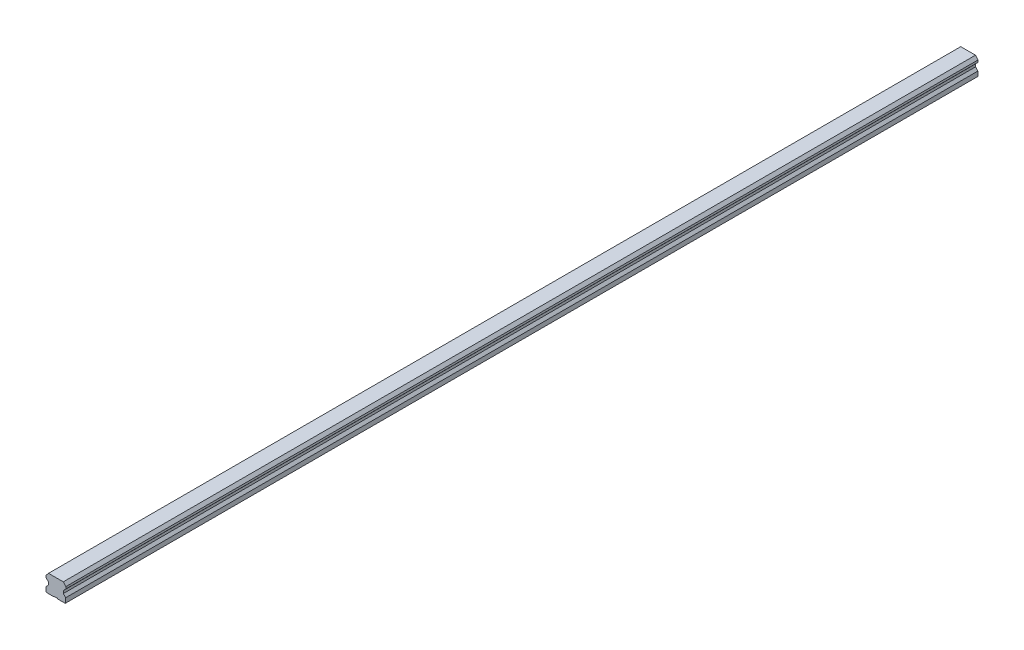
ISO-10303-21;
HEADER;
FILE_DESCRIPTION(('STEP AP214'),'2;1');
FILE_NAME('part.step','',(''),(''),'','','');
FILE_SCHEMA(('AUTOMOTIVE_DESIGN { 1 0 10303 214 1 1 1 1 }'));
ENDSEC;
DATA;
#1=APPLICATION_CONTEXT('core data for automotive mechanical design processes');
#2=APPLICATION_PROTOCOL_DEFINITION('international standard','automotive_design',2000,#1);
#3=PRODUCT_CONTEXT('',#1,'mechanical');
#4=PRODUCT('Part','Part','',(#3));
#5=PRODUCT_RELATED_PRODUCT_CATEGORY('part','',(#4));
#6=PRODUCT_DEFINITION_FORMATION('','',#4);
#7=PRODUCT_DEFINITION_CONTEXT('part definition',#1,'design');
#8=PRODUCT_DEFINITION('design','',#6,#7);
#9=PRODUCT_DEFINITION_SHAPE('','',#8);
#10=(LENGTH_UNIT() NAMED_UNIT(*) SI_UNIT(.MILLI.,.METRE.));
#11=(NAMED_UNIT(*) PLANE_ANGLE_UNIT() SI_UNIT($,.RADIAN.));
#12=(NAMED_UNIT(*) SI_UNIT($,.STERADIAN.) SOLID_ANGLE_UNIT());
#13=UNCERTAINTY_MEASURE_WITH_UNIT(LENGTH_MEASURE(1.E-05),#10,'distance_accuracy_value','');
#14=(GEOMETRIC_REPRESENTATION_CONTEXT(3) GLOBAL_UNCERTAINTY_ASSIGNED_CONTEXT((#13)) GLOBAL_UNIT_ASSIGNED_CONTEXT((#10,
#11,#12)) REPRESENTATION_CONTEXT('',''));
#15=CARTESIAN_POINT('',(0.,0.,0.));
#16=DIRECTION('',(0.,0.,1.));
#17=DIRECTION('',(1.,0.,0.));
#18=AXIS2_PLACEMENT_3D('',#15,#16,#17);
#19=CARTESIAN_POINT('',(20.8842821370548,-19.4456485052694,470.));
#20=DIRECTION('',(0.722739769745018,0.691120268281085,0.));
#21=DIRECTION('',(-0.691120268281085,0.722739769745018,0.));
#22=AXIS2_PLACEMENT_3D('',#19,#20,#21);
#23=PLANE('',#22);
#24=DIRECTION('',(0.691120268281085,-0.722739769745018,0.));
#25=VECTOR('',#24,1.);
#26=CARTESIAN_POINT('',(20.8842821370548,-19.4456485052694,-470.));
#27=LINE('',#26,#25);
#28=CARTESIAN_POINT('',(-10.1981866075721,13.0588768785266,-470.));
#29=VERTEX_POINT('',#28);
#30=CARTESIAN_POINT('',(-7.69251945870158,10.4385727413951,-470.));
#31=VERTEX_POINT('',#30);
#32=EDGE_CURVE('E206',#29,#31,#27,.T.);
#33=ORIENTED_EDGE('',*,*,#32,.T.);
#34=DIRECTION('',(0.,0.,-1.));
#35=VECTOR('',#34,1.);
#36=CARTESIAN_POINT('',(-7.69251945870158,10.4385727413951,470.));
#37=LINE('',#36,#35);
#38=CARTESIAN_POINT('',(-7.69251945870158,10.4385727413951,470.));
#39=VERTEX_POINT('',#38);
#40=EDGE_CURVE('E11',#39,#31,#37,.T.);
#41=ORIENTED_EDGE('',*,*,#40,.F.);
#42=DIRECTION('',(0.691120268281085,-0.722739769745018,0.));
#43=VECTOR('',#42,1.);
#44=CARTESIAN_POINT('',(20.8842821370548,-19.4456485052694,470.));
#45=LINE('',#44,#43);
#46=CARTESIAN_POINT('',(-10.1981866075721,13.0588768785266,470.));
#47=VERTEX_POINT('',#46);
#48=EDGE_CURVE('E256',#47,#39,#45,.T.);
#49=ORIENTED_EDGE('',*,*,#48,.F.);
#50=DIRECTION('',(0.,0.,-1.));
#51=VECTOR('',#50,1.);
#52=CARTESIAN_POINT('',(-10.1981866075721,13.0588768785266,470.));
#53=LINE('',#52,#51);
#54=EDGE_CURVE('E202',#47,#29,#53,.T.);
#55=ORIENTED_EDGE('',*,*,#54,.T.);
#56=EDGE_LOOP('',(#33,#41,#49,#55));
#57=FACE_BOUND('',#56,.T.);
#58=ADVANCED_FACE('F38',(#57),#23,.F.);
#59=CARTESIAN_POINT('',(-7.69251945870158,-39.4161333167955,470.));
#60=DIRECTION('',(1.,0.,0.));
#61=DIRECTION('',(0.,0.,-1.));
#62=AXIS2_PLACEMENT_3D('',#59,#60,#61);
#63=PLANE('',#62);
#64=DIRECTION('',(0.,-1.,0.));
#65=VECTOR('',#64,1.);
#66=CARTESIAN_POINT('',(-7.69251945870158,-39.4161333167955,-470.));
#67=LINE('',#66,#65);
#68=CARTESIAN_POINT('',(-7.69251945870158,7.78995369345772,-470.));
#69=VERTEX_POINT('',#68);
#70=EDGE_CURVE('E209',#31,#69,#67,.T.);
#71=ORIENTED_EDGE('',*,*,#70,.T.);
#72=DIRECTION('',(0.,0.,-1.));
#73=VECTOR('',#72,1.);
#74=CARTESIAN_POINT('',(-7.69251945870158,7.78995369345772,470.));
#75=LINE('',#74,#73);
#76=CARTESIAN_POINT('',(-7.69251945870158,7.78995369345772,470.));
#77=VERTEX_POINT('',#76);
#78=EDGE_CURVE('E46',#77,#69,#75,.T.);
#79=ORIENTED_EDGE('',*,*,#78,.F.);
#80=DIRECTION('',(0.,-1.,0.));
#81=VECTOR('',#80,1.);
#82=CARTESIAN_POINT('',(-7.69251945870158,-39.4161333167955,470.));
#83=LINE('',#82,#81);
#84=EDGE_CURVE('E133',#39,#77,#83,.T.);
#85=ORIENTED_EDGE('',*,*,#84,.F.);
#86=ORIENTED_EDGE('',*,*,#40,.T.);
#87=EDGE_LOOP('',(#71,#79,#85,#86));
#88=FACE_BOUND('',#87,.T.);
#89=ADVANCED_FACE('F297',(#88),#63,.F.);
#90=CARTESIAN_POINT('',(-27.7475258961734,-15.0229471892646,470.));
#91=DIRECTION('',(-0.751045624765041,0.660250308232635,0.));
#92=DIRECTION('',(-0.660250308232635,-0.751045624765041,0.));
#93=AXIS2_PLACEMENT_3D('',#90,#91,#92);
#94=PLANE('',#93);
#95=DIRECTION('',(0.660250308232635,0.75104562476504,0.));
#96=VECTOR('',#95,1.);
#97=CARTESIAN_POINT('',(-27.7475258961734,-15.0229471892646,-470.));
#98=LINE('',#97,#96);
#99=CARTESIAN_POINT('',(-9.99999999999999,5.1651564867565,-470.));
#100=VERTEX_POINT('',#99);
#101=EDGE_CURVE('E212',#100,#69,#98,.T.);
#102=ORIENTED_EDGE('',*,*,#101,.F.);
#103=DIRECTION('',(0.,0.,-1.));
#104=VECTOR('',#103,1.);
#105=CARTESIAN_POINT('',(-9.99999999999999,5.1651564867565,470.));
#106=LINE('',#105,#104);
#107=CARTESIAN_POINT('',(-9.99999999999999,5.1651564867565,470.));
#108=VERTEX_POINT('',#107);
#109=EDGE_CURVE('E290',#108,#100,#106,.T.);
#110=ORIENTED_EDGE('',*,*,#109,.F.);
#111=DIRECTION('',(0.660250308232635,0.75104562476504,0.));
#112=VECTOR('',#111,1.);
#113=CARTESIAN_POINT('',(-27.7475258961734,-15.0229471892646,470.));
#114=LINE('',#113,#112);
#115=EDGE_CURVE('E296',#108,#77,#114,.T.);
#116=ORIENTED_EDGE('',*,*,#115,.T.);
#117=ORIENTED_EDGE('',*,*,#78,.T.);
#118=EDGE_LOOP('',(#102,#110,#116,#117));
#119=FACE_BOUND('',#118,.T.);
#120=ADVANCED_FACE('F294',(#119),#94,.T.);
#121=CARTESIAN_POINT('',(-9.99999999999999,-39.4161333167955,470.));
#122=DIRECTION('',(-1.,0.,0.));
#123=DIRECTION('',(0.,0.,1.));
#124=AXIS2_PLACEMENT_3D('',#121,#122,#123);
#125=PLANE('',#124);
#126=DIRECTION('',(0.,1.,0.));
#127=VECTOR('',#126,1.);
#128=CARTESIAN_POINT('',(-9.99999999999999,-39.4161333167955,-470.));
#129=LINE('',#128,#127);
#130=CARTESIAN_POINT('',(-9.99999999999999,0.355272087358919,-470.));
#131=VERTEX_POINT('',#130);
#132=EDGE_CURVE('E215',#131,#100,#129,.T.);
#133=ORIENTED_EDGE('',*,*,#132,.F.);
#134=DIRECTION('',(0.,0.,-1.));
#135=VECTOR('',#134,1.);
#136=CARTESIAN_POINT('',(-9.99999999999999,0.355272087358919,470.));
#137=LINE('',#136,#135);
#138=CARTESIAN_POINT('',(-9.99999999999999,0.355272087358919,470.));
#139=VERTEX_POINT('',#138);
#140=EDGE_CURVE('E288',#139,#131,#137,.T.);
#141=ORIENTED_EDGE('',*,*,#140,.F.);
#142=DIRECTION('',(0.,1.,0.));
#143=VECTOR('',#142,1.);
#144=CARTESIAN_POINT('',(-9.99999999999999,-39.4161333167955,470.));
#145=LINE('',#144,#143);
#146=EDGE_CURVE('E310',#139,#108,#145,.T.);
#147=ORIENTED_EDGE('',*,*,#146,.T.);
#148=ORIENTED_EDGE('',*,*,#109,.T.);
#149=EDGE_LOOP('',(#133,#141,#147,#148));
#150=FACE_BOUND('',#149,.T.);
#151=ADVANCED_FACE('F306',(#150),#125,.T.);
#152=CARTESIAN_POINT('',(14.8857657005482,-24.5304936131893,470.));
#153=DIRECTION('',(0.707106781186547,0.707106781186547,0.));
#154=DIRECTION('',(-0.707106781186548,0.707106781186548,0.));
#155=AXIS2_PLACEMENT_3D('',#152,#153,#154);
#156=PLANE('',#155);
#157=DIRECTION('',(0.707106781186548,-0.707106781186548,0.));
#158=VECTOR('',#157,1.);
#159=CARTESIAN_POINT('',(14.8857657005482,-24.5304936131893,-470.));
#160=LINE('',#159,#158);
#161=CARTESIAN_POINT('',(-9.64472791264107,0.,-470.));
#162=VERTEX_POINT('',#161);
#163=EDGE_CURVE('E218',#131,#162,#160,.T.);
#164=ORIENTED_EDGE('',*,*,#163,.T.);
#165=DIRECTION('',(0.,0.,-1.));
#166=VECTOR('',#165,1.);
#167=CARTESIAN_POINT('',(-9.64472791264107,0.,470.));
#168=LINE('',#167,#166);
#169=CARTESIAN_POINT('',(-9.64472791264107,0.,470.));
#170=VERTEX_POINT('',#169);
#171=EDGE_CURVE('E285',#170,#162,#168,.T.);
#172=ORIENTED_EDGE('',*,*,#171,.F.);
#173=DIRECTION('',(0.707106781186548,-0.707106781186548,0.));
#174=VECTOR('',#173,1.);
#175=CARTESIAN_POINT('',(14.8857657005482,-24.5304936131893,470.));
#176=LINE('',#175,#174);
#177=EDGE_CURVE('E312',#139,#170,#176,.T.);
#178=ORIENTED_EDGE('',*,*,#177,.F.);
#179=ORIENTED_EDGE('',*,*,#140,.T.);
#180=EDGE_LOOP('',(#164,#172,#178,#179));
#181=FACE_BOUND('',#180,.T.);
#182=ADVANCED_FACE('F371',(#181),#156,.F.);
#183=CARTESIAN_POINT('',(0.000125996942072825,0.,470.));
#184=DIRECTION('',(0.,1.,0.));
#185=DIRECTION('',(0.,0.,1.));
#186=AXIS2_PLACEMENT_3D('',#183,#184,#185);
#187=PLANE('',#186);
#188=DIRECTION('',(1.,0.,0.));
#189=VECTOR('',#188,1.);
#190=CARTESIAN_POINT('',(0.000125996942072825,0.,-470.));
#191=LINE('',#190,#189);
#192=CARTESIAN_POINT('',(-2.00094393332283,0.,-470.));
#193=VERTEX_POINT('',#192);
#194=EDGE_CURVE('E220',#162,#193,#191,.T.);
#195=ORIENTED_EDGE('',*,*,#194,.T.);
#196=DIRECTION('',(0.,0.,-1.));
#197=VECTOR('',#196,1.);
#198=CARTESIAN_POINT('',(-2.00094393332283,0.,470.));
#199=LINE('',#198,#197);
#200=CARTESIAN_POINT('',(-2.00094393332283,0.,470.));
#201=VERTEX_POINT('',#200);
#202=EDGE_CURVE('E283',#201,#193,#199,.T.);
#203=ORIENTED_EDGE('',*,*,#202,.F.);
#204=DIRECTION('',(1.,0.,0.));
#205=VECTOR('',#204,1.);
#206=CARTESIAN_POINT('',(0.000125996942072825,0.,470.));
#207=LINE('',#206,#205);
#208=EDGE_CURVE('E318',#170,#201,#207,.T.);
#209=ORIENTED_EDGE('',*,*,#208,.F.);
#210=ORIENTED_EDGE('',*,*,#171,.T.);
#211=EDGE_LOOP('',(#195,#203,#209,#210));
#212=FACE_BOUND('',#211,.T.);
#213=ADVANCED_FACE('F374',(#212),#187,.F.);
#214=CARTESIAN_POINT('',(-20.4405587166224,-23.0976889658,470.));
#215=DIRECTION('',(0.781504438337596,-0.623899681726668,0.));
#216=DIRECTION('',(0.623899681726668,0.781504438337597,0.));
#217=AXIS2_PLACEMENT_3D('',#214,#215,#216);
#218=PLANE('',#217);
#219=DIRECTION('',(-0.623899681726668,-0.781504438337597,0.));
#220=VECTOR('',#219,1.);
#221=CARTESIAN_POINT('',(-20.4405587166224,-23.0976889658,-470.));
#222=LINE('',#221,#220);
#223=CARTESIAN_POINT('',(-1.65012599694227,0.439438875126652,-470.));
#224=VERTEX_POINT('',#223);
#225=EDGE_CURVE('E223',#224,#193,#222,.T.);
#226=ORIENTED_EDGE('',*,*,#225,.F.);
#227=DIRECTION('',(0.,0.,-1.));
#228=VECTOR('',#227,1.);
#229=CARTESIAN_POINT('',(-1.65012599694227,0.439438875126652,470.));
#230=LINE('',#229,#228);
#231=CARTESIAN_POINT('',(-1.65012599694227,0.439438875126652,470.));
#232=VERTEX_POINT('',#231);
#233=EDGE_CURVE('E281',#232,#224,#230,.T.);
#234=ORIENTED_EDGE('',*,*,#233,.F.);
#235=DIRECTION('',(-0.623899681726668,-0.781504438337597,0.));
#236=VECTOR('',#235,1.);
#237=CARTESIAN_POINT('',(-20.4405587166224,-23.0976889658,470.));
#238=LINE('',#237,#236);
#239=EDGE_CURVE('E320',#232,#201,#238,.T.);
#240=ORIENTED_EDGE('',*,*,#239,.T.);
#241=ORIENTED_EDGE('',*,*,#202,.T.);
#242=EDGE_LOOP('',(#226,#234,#240,#241));
#243=FACE_BOUND('',#242,.T.);
#244=ADVANCED_FACE('F378',(#243),#218,.T.);
#245=CARTESIAN_POINT('',(0.000125996942072825,0.439438875126652,470.));
#246=DIRECTION('',(0.,1.,0.));
#247=DIRECTION('',(0.,0.,1.));
#248=AXIS2_PLACEMENT_3D('',#245,#246,#247);
#249=PLANE('',#248);
#250=DIRECTION('',(1.,0.,0.));
#251=VECTOR('',#250,1.);
#252=CARTESIAN_POINT('',(0.000125996942072825,0.439438875126652,-470.));
#253=LINE('',#252,#251);
#254=CARTESIAN_POINT('',(1.65012599694227,0.439438875126652,-470.));
#255=VERTEX_POINT('',#254);
#256=EDGE_CURVE('E226',#224,#255,#253,.T.);
#257=ORIENTED_EDGE('',*,*,#256,.T.);
#258=DIRECTION('',(0.,0.,-1.));
#259=VECTOR('',#258,1.);
#260=CARTESIAN_POINT('',(1.65012599694227,0.439438875126652,470.));
#261=LINE('',#260,#259);
#262=CARTESIAN_POINT('',(1.65012599694227,0.439438875126652,470.));
#263=VERTEX_POINT('',#262);
#264=EDGE_CURVE('E278',#263,#255,#261,.T.);
#265=ORIENTED_EDGE('',*,*,#264,.F.);
#266=DIRECTION('',(1.,0.,0.));
#267=VECTOR('',#266,1.);
#268=CARTESIAN_POINT('',(0.000125996942072825,0.439438875126652,470.));
#269=LINE('',#268,#267);
#270=EDGE_CURVE('E323',#232,#263,#269,.T.);
#271=ORIENTED_EDGE('',*,*,#270,.F.);
#272=ORIENTED_EDGE('',*,*,#233,.T.);
#273=EDGE_LOOP('',(#257,#265,#271,#272));
#274=FACE_BOUND('',#273,.T.);
#275=ADVANCED_FACE('F382',(#274),#249,.F.);
#276=CARTESIAN_POINT('',(20.4406568054453,-23.0978118330785,470.));
#277=DIRECTION('',(0.781504438337711,0.623899681726525,0.));
#278=DIRECTION('',(-0.623899681726525,0.781504438337711,0.));
#279=AXIS2_PLACEMENT_3D('',#276,#277,#278);
#280=PLANE('',#279);
#281=DIRECTION('',(0.623899681726525,-0.781504438337711,0.));
#282=VECTOR('',#281,1.);
#283=CARTESIAN_POINT('',(20.4406568054453,-23.0978118330785,-470.));
#284=LINE('',#283,#282);
#285=CARTESIAN_POINT('',(2.0009439333227,0.,-470.));
#286=VERTEX_POINT('',#285);
#287=EDGE_CURVE('E228',#255,#286,#284,.T.);
#288=ORIENTED_EDGE('',*,*,#287,.T.);
#289=DIRECTION('',(0.,0.,-1.));
#290=VECTOR('',#289,1.);
#291=CARTESIAN_POINT('',(2.0009439333227,0.,470.));
#292=LINE('',#291,#290);
#293=CARTESIAN_POINT('',(2.0009439333227,0.,470.));
#294=VERTEX_POINT('',#293);
#295=EDGE_CURVE('E275',#294,#286,#292,.T.);
#296=ORIENTED_EDGE('',*,*,#295,.F.);
#297=DIRECTION('',(0.623899681726525,-0.781504438337711,0.));
#298=VECTOR('',#297,1.);
#299=CARTESIAN_POINT('',(20.4406568054453,-23.0978118330785,470.));
#300=LINE('',#299,#298);
#301=EDGE_CURVE('E325',#263,#294,#300,.T.);
#302=ORIENTED_EDGE('',*,*,#301,.F.);
#303=ORIENTED_EDGE('',*,*,#264,.T.);
#304=EDGE_LOOP('',(#288,#296,#302,#303));
#305=FACE_BOUND('',#304,.T.);
#306=ADVANCED_FACE('F386',(#305),#280,.F.);
#307=CARTESIAN_POINT('',(0.000125996942072825,0.,470.));
#308=DIRECTION('',(0.,1.,0.));
#309=DIRECTION('',(0.,0.,1.));
#310=AXIS2_PLACEMENT_3D('',#307,#308,#309);
#311=PLANE('',#310);
#312=DIRECTION('',(1.,0.,0.));
#313=VECTOR('',#312,1.);
#314=CARTESIAN_POINT('',(0.000125996942072825,0.,-470.));
#315=LINE('',#314,#313);
#316=CARTESIAN_POINT('',(9.64472791264097,0.,-470.));
#317=VERTEX_POINT('',#316);
#318=EDGE_CURVE('E230',#286,#317,#315,.T.);
#319=ORIENTED_EDGE('',*,*,#318,.T.);
#320=DIRECTION('',(0.,0.,-1.));
#321=VECTOR('',#320,1.);
#322=CARTESIAN_POINT('',(9.64472791264097,0.,470.));
#323=LINE('',#322,#321);
#324=CARTESIAN_POINT('',(9.64472791264097,0.,470.));
#325=VERTEX_POINT('',#324);
#326=EDGE_CURVE('E273',#325,#317,#323,.T.);
#327=ORIENTED_EDGE('',*,*,#326,.F.);
#328=DIRECTION('',(1.,0.,0.));
#329=VECTOR('',#328,1.);
#330=CARTESIAN_POINT('',(0.000125996942072825,0.,470.));
#331=LINE('',#330,#329);
#332=EDGE_CURVE('E327',#294,#325,#331,.T.);
#333=ORIENTED_EDGE('',*,*,#332,.F.);
#334=ORIENTED_EDGE('',*,*,#295,.T.);
#335=EDGE_LOOP('',(#319,#327,#333,#334));
#336=FACE_BOUND('',#335,.T.);
#337=ADVANCED_FACE('F390',(#336),#311,.F.);
#338=CARTESIAN_POINT('',(-14.8856397036062,-24.5303676162472,470.));
#339=DIRECTION('',(0.707106781186547,-0.707106781186547,0.));
#340=DIRECTION('',(0.707106781186548,0.707106781186548,0.));
#341=AXIS2_PLACEMENT_3D('',#338,#339,#340);
#342=PLANE('',#341);
#343=DIRECTION('',(-0.707106781186548,-0.707106781186548,0.));
#344=VECTOR('',#343,1.);
#345=CARTESIAN_POINT('',(-14.8856397036062,-24.5303676162472,-470.));
#346=LINE('',#345,#344);
#347=CARTESIAN_POINT('',(10.,0.355272087359037,-470.));
#348=VERTEX_POINT('',#347);
#349=EDGE_CURVE('E233',#348,#317,#346,.T.);
#350=ORIENTED_EDGE('',*,*,#349,.F.);
#351=DIRECTION('',(0.,0.,-1.));
#352=VECTOR('',#351,1.);
#353=CARTESIAN_POINT('',(10.,0.355272087359037,470.));
#354=LINE('',#353,#352);
#355=CARTESIAN_POINT('',(10.,0.355272087359037,470.));
#356=VERTEX_POINT('',#355);
#357=EDGE_CURVE('E271',#356,#348,#354,.T.);
#358=ORIENTED_EDGE('',*,*,#357,.F.);
#359=DIRECTION('',(-0.707106781186548,-0.707106781186548,0.));
#360=VECTOR('',#359,1.);
#361=CARTESIAN_POINT('',(-14.8856397036062,-24.5303676162472,470.));
#362=LINE('',#361,#360);
#363=EDGE_CURVE('E329',#356,#325,#362,.T.);
#364=ORIENTED_EDGE('',*,*,#363,.T.);
#365=ORIENTED_EDGE('',*,*,#326,.T.);
#366=EDGE_LOOP('',(#350,#358,#364,#365));
#367=FACE_BOUND('',#366,.T.);
#368=ADVANCED_FACE('F394',(#367),#342,.T.);
#369=CARTESIAN_POINT('',(10.,-39.4161333167955,470.));
#370=DIRECTION('',(-1.,0.,0.));
#371=DIRECTION('',(0.,-1.,0.));
#372=AXIS2_PLACEMENT_3D('',#369,#370,#371);
#373=PLANE('',#372);
#374=DIRECTION('',(0.,1.,0.));
#375=VECTOR('',#374,1.);
#376=CARTESIAN_POINT('',(10.,-39.4161333167955,-470.));
#377=LINE('',#376,#375);
#378=CARTESIAN_POINT('',(10.,5.16515648675632,-470.));
#379=VERTEX_POINT('',#378);
#380=EDGE_CURVE('E236',#348,#379,#377,.T.);
#381=ORIENTED_EDGE('',*,*,#380,.T.);
#382=DIRECTION('',(0.,0.,-1.));
#383=VECTOR('',#382,1.);
#384=CARTESIAN_POINT('',(10.,5.16515648675632,470.));
#385=LINE('',#384,#383);
#386=CARTESIAN_POINT('',(10.,5.16515648675632,470.));
#387=VERTEX_POINT('',#386);
#388=EDGE_CURVE('E268',#387,#379,#385,.T.);
#389=ORIENTED_EDGE('',*,*,#388,.F.);
#390=DIRECTION('',(0.,1.,0.));
#391=VECTOR('',#390,1.);
#392=CARTESIAN_POINT('',(10.,-39.4161333167955,470.));
#393=LINE('',#392,#391);
#394=EDGE_CURVE('E332',#356,#387,#393,.T.);
#395=ORIENTED_EDGE('',*,*,#394,.F.);
#396=ORIENTED_EDGE('',*,*,#357,.T.);
#397=EDGE_LOOP('',(#381,#389,#395,#396));
#398=FACE_BOUND('',#397,.T.);
#399=ADVANCED_FACE('F398',(#398),#373,.F.);
#400=CARTESIAN_POINT('',(27.7476357479856,-15.0230721475144,470.));
#401=DIRECTION('',(-0.75104562476504,-0.660250308232636,0.));
#402=DIRECTION('',(0.660250308232636,-0.75104562476504,0.));
#403=AXIS2_PLACEMENT_3D('',#400,#401,#402);
#404=PLANE('',#403);
#405=DIRECTION('',(-0.660250308232636,0.75104562476504,0.));
#406=VECTOR('',#405,1.);
#407=CARTESIAN_POINT('',(27.7476357479856,-15.0230721475144,-470.));
#408=LINE('',#407,#406);
#409=CARTESIAN_POINT('',(7.69251945870144,7.7899536934577,-470.));
#410=VERTEX_POINT('',#409);
#411=EDGE_CURVE('E238',#379,#410,#408,.T.);
#412=ORIENTED_EDGE('',*,*,#411,.T.);
#413=DIRECTION('',(0.,0.,-1.));
#414=VECTOR('',#413,1.);
#415=CARTESIAN_POINT('',(7.69251945870144,7.7899536934577,470.));
#416=LINE('',#415,#414);
#417=CARTESIAN_POINT('',(7.69251945870144,7.7899536934577,470.));
#418=VERTEX_POINT('',#417);
#419=EDGE_CURVE('E266',#418,#410,#416,.T.);
#420=ORIENTED_EDGE('',*,*,#419,.F.);
#421=DIRECTION('',(-0.660250308232636,0.75104562476504,0.));
#422=VECTOR('',#421,1.);
#423=CARTESIAN_POINT('',(27.7476357479856,-15.0230721475144,470.));
#424=LINE('',#423,#422);
#425=EDGE_CURVE('E334',#387,#418,#424,.T.);
#426=ORIENTED_EDGE('',*,*,#425,.F.);
#427=ORIENTED_EDGE('',*,*,#388,.T.);
#428=EDGE_LOOP('',(#412,#420,#426,#427));
#429=FACE_BOUND('',#428,.T.);
#430=ADVANCED_FACE('F402',(#429),#404,.F.);
#431=CARTESIAN_POINT('',(7.69251945870145,-39.4161333167955,470.));
#432=DIRECTION('',(1.,0.,0.));
#433=DIRECTION('',(0.,0.,-1.));
#434=AXIS2_PLACEMENT_3D('',#431,#432,#433);
#435=PLANE('',#434);
#436=DIRECTION('',(0.,-1.,0.));
#437=VECTOR('',#436,1.);
#438=CARTESIAN_POINT('',(7.69251945870145,-39.4161333167955,-470.));
#439=LINE('',#438,#437);
#440=CARTESIAN_POINT('',(7.69251945870145,10.438572741395,-470.));
#441=VERTEX_POINT('',#440);
#442=EDGE_CURVE('E241',#441,#410,#439,.T.);
#443=ORIENTED_EDGE('',*,*,#442,.F.);
#444=DIRECTION('',(0.,0.,-1.));
#445=VECTOR('',#444,1.);
#446=CARTESIAN_POINT('',(7.69251945870145,10.438572741395,470.));
#447=LINE('',#446,#445);
#448=CARTESIAN_POINT('',(7.69251945870145,10.438572741395,470.));
#449=VERTEX_POINT('',#448);
#450=EDGE_CURVE('E264',#449,#441,#447,.T.);
#451=ORIENTED_EDGE('',*,*,#450,.F.);
#452=DIRECTION('',(0.,-1.,0.));
#453=VECTOR('',#452,1.);
#454=CARTESIAN_POINT('',(7.69251945870145,-39.4161333167955,470.));
#455=LINE('',#454,#453);
#456=EDGE_CURVE('E336',#449,#418,#455,.T.);
#457=ORIENTED_EDGE('',*,*,#456,.T.);
#458=ORIENTED_EDGE('',*,*,#419,.T.);
#459=EDGE_LOOP('',(#443,#451,#457,#458));
#460=FACE_BOUND('',#459,.T.);
#461=ADVANCED_FACE('F406',(#460),#435,.T.);
#462=CARTESIAN_POINT('',(-20.8841617728744,-19.4455226343027,470.));
#463=DIRECTION('',(0.722739769745083,-0.691120268281017,0.));
#464=DIRECTION('',(0.691120268281017,0.722739769745083,0.));
#465=AXIS2_PLACEMENT_3D('',#462,#463,#464);
#466=PLANE('',#465);
#467=DIRECTION('',(-0.691120268281017,-0.722739769745083,0.));
#468=VECTOR('',#467,1.);
#469=CARTESIAN_POINT('',(-20.8841617728744,-19.4455226343027,-470.));
#470=LINE('',#469,#468);
#471=CARTESIAN_POINT('',(10.1981866075715,13.0588768785265,-470.));
#472=VERTEX_POINT('',#471);
#473=EDGE_CURVE('E244',#472,#441,#470,.T.);
#474=ORIENTED_EDGE('',*,*,#473,.F.);
#475=DIRECTION('',(0.,0.,-1.));
#476=VECTOR('',#475,1.);
#477=CARTESIAN_POINT('',(10.1981866075715,13.0588768785265,470.));
#478=LINE('',#477,#476);
#479=CARTESIAN_POINT('',(10.1981866075715,13.0588768785265,470.));
#480=VERTEX_POINT('',#479);
#481=EDGE_CURVE('E262',#480,#472,#478,.T.);
#482=ORIENTED_EDGE('',*,*,#481,.F.);
#483=DIRECTION('',(-0.691120268281017,-0.722739769745083,0.));
#484=VECTOR('',#483,1.);
#485=CARTESIAN_POINT('',(-20.8841617728744,-19.4455226343027,470.));
#486=LINE('',#485,#484);
#487=EDGE_CURVE('E339',#480,#449,#486,.T.);
#488=ORIENTED_EDGE('',*,*,#487,.T.);
#489=ORIENTED_EDGE('',*,*,#450,.T.);
#490=EDGE_LOOP('',(#474,#482,#488,#489));
#491=FACE_BOUND('',#490,.T.);
#492=ADVANCED_FACE('F410',(#491),#466,.T.);
#493=CARTESIAN_POINT('',(10.2012600108081,-39.4155358408702,470.));
#494=DIRECTION('',(0.999999998284803,5.8569559373139E-05,0.));
#495=DIRECTION('',(-5.8569559373139E-05,0.999999998284803,0.));
#496=AXIS2_PLACEMENT_3D('',#493,#494,#495);
#497=PLANE('',#496);
#498=DIRECTION('',(5.8569559373139E-05,-0.999999998284803,0.));
#499=VECTOR('',#498,1.);
#500=CARTESIAN_POINT('',(10.2012600108081,-39.4155358408702,-470.));
#501=LINE('',#500,#499);
#502=CARTESIAN_POINT('',(10.1980605169538,15.2117122226539,-470.));
#503=VERTEX_POINT('',#502);
#504=EDGE_CURVE('E247',#503,#472,#501,.T.);
#505=ORIENTED_EDGE('',*,*,#504,.F.);
#506=DIRECTION('',(0.,0.,-1.));
#507=VECTOR('',#506,1.);
#508=CARTESIAN_POINT('',(10.1980605169538,15.2117122226539,470.));
#509=LINE('',#508,#507);
#510=CARTESIAN_POINT('',(10.1980605169538,15.2117122226539,470.));
#511=VERTEX_POINT('',#510);
#512=EDGE_CURVE('E260',#511,#503,#509,.T.);
#513=ORIENTED_EDGE('',*,*,#512,.F.);
#514=DIRECTION('',(5.8569559373139E-05,-0.999999998284803,0.));
#515=VECTOR('',#514,1.);
#516=CARTESIAN_POINT('',(10.2012600108081,-39.4155358408702,470.));
#517=LINE('',#516,#515);
#518=EDGE_CURVE('E342',#511,#480,#517,.T.);
#519=ORIENTED_EDGE('',*,*,#518,.T.);
#520=ORIENTED_EDGE('',*,*,#481,.T.);
#521=EDGE_LOOP('',(#505,#513,#519,#520));
#522=FACE_BOUND('',#521,.T.);
#523=ADVANCED_FACE('F414',(#522),#497,.T.);
#524=CARTESIAN_POINT('',(32.8512327946364,-10.735244830689,470.));
#525=DIRECTION('',(0.753301597212822,0.657675226564458,0.));
#526=DIRECTION('',(-0.657675226564458,0.753301597212822,0.));
#527=AXIS2_PLACEMENT_3D('',#524,#525,#526);
#528=PLANE('',#527);
#529=DIRECTION('',(0.657675226564458,-0.753301597212822,0.));
#530=VECTOR('',#529,1.);
#531=CARTESIAN_POINT('',(32.8512327946364,-10.735244830689,-470.));
#532=LINE('',#531,#530);
#533=CARTESIAN_POINT('',(7.59834006703162,18.1894335783195,-470.));
#534=VERTEX_POINT('',#533);
#535=EDGE_CURVE('E250',#534,#503,#532,.T.);
#536=ORIENTED_EDGE('',*,*,#535,.F.);
#537=DIRECTION('',(0.,0.,-1.));
#538=VECTOR('',#537,1.);
#539=CARTESIAN_POINT('',(7.59834006703162,18.1894335783195,470.));
#540=LINE('',#539,#538);
#541=CARTESIAN_POINT('',(7.59834006703162,18.1894335783195,470.));
#542=VERTEX_POINT('',#541);
#543=EDGE_CURVE('E197',#542,#534,#540,.T.);
#544=ORIENTED_EDGE('',*,*,#543,.F.);
#545=DIRECTION('',(0.657675226564458,-0.753301597212822,0.));
#546=VECTOR('',#545,1.);
#547=CARTESIAN_POINT('',(32.8512327946364,-10.735244830689,470.));
#548=LINE('',#547,#546);
#549=EDGE_CURVE('E190',#542,#511,#548,.T.);
#550=ORIENTED_EDGE('',*,*,#549,.T.);
#551=ORIENTED_EDGE('',*,*,#512,.T.);
#552=EDGE_LOOP('',(#536,#544,#550,#551));
#553=FACE_BOUND('',#552,.T.);
#554=ADVANCED_FACE('F346',(#553),#528,.T.);
#555=CARTESIAN_POINT('',(0.000125996942072825,18.1894335783195,470.));
#556=DIRECTION('',(0.,-1.,0.));
#557=DIRECTION('',(0.,0.,-1.));
#558=AXIS2_PLACEMENT_3D('',#555,#556,#557);
#559=PLANE('',#558);
#560=DIRECTION('',(-1.,0.,0.));
#561=VECTOR('',#560,1.);
#562=CARTESIAN_POINT('',(0.000125996942072825,18.1894335783195,-470.));
#563=LINE('',#562,#561);
#564=CARTESIAN_POINT('',(-7.59846615764992,18.1894335783195,-470.));
#565=VERTEX_POINT('',#564);
#566=EDGE_CURVE('E196',#534,#565,#563,.T.);
#567=ORIENTED_EDGE('',*,*,#566,.T.);
#568=DIRECTION('',(0.,0.,-1.));
#569=VECTOR('',#568,1.);
#570=CARTESIAN_POINT('',(-7.59846615764992,18.1894335783195,470.));
#571=LINE('',#570,#569);
#572=CARTESIAN_POINT('',(-7.59846615764992,18.1894335783195,470.));
#573=VERTEX_POINT('',#572);
#574=EDGE_CURVE('E193',#573,#565,#571,.T.);
#575=ORIENTED_EDGE('',*,*,#574,.F.);
#576=DIRECTION('',(-1.,0.,0.));
#577=VECTOR('',#576,1.);
#578=CARTESIAN_POINT('',(0.000125996942072825,18.1894335783195,470.));
#579=LINE('',#578,#577);
#580=EDGE_CURVE('E183',#542,#573,#579,.T.);
#581=ORIENTED_EDGE('',*,*,#580,.F.);
#582=ORIENTED_EDGE('',*,*,#543,.T.);
#583=EDGE_LOOP('',(#567,#575,#581,#582));
#584=FACE_BOUND('',#583,.T.);
#585=ADVANCED_FACE('F194',(#584),#559,.F.);
#586=CARTESIAN_POINT('',(-32.8511953498303,-10.735057517116,470.));
#587=DIRECTION('',(0.753301597212819,-0.657675226564461,0.));
#588=DIRECTION('',(0.657675226564461,0.753301597212819,0.));
#589=AXIS2_PLACEMENT_3D('',#586,#587,#588);
#590=PLANE('',#589);
#591=DIRECTION('',(-0.657675226564461,-0.753301597212819,0.));
#592=VECTOR('',#591,1.);
#593=CARTESIAN_POINT('',(-32.8511953498303,-10.735057517116,-470.));
#594=LINE('',#593,#592);
#595=CARTESIAN_POINT('',(-10.1981866075721,15.2117122226539,-470.));
#596=VERTEX_POINT('',#595);
#597=EDGE_CURVE('E119',#565,#596,#594,.T.);
#598=ORIENTED_EDGE('',*,*,#597,.T.);
#599=DIRECTION('',(0.,0.,-1.));
#600=VECTOR('',#599,1.);
#601=CARTESIAN_POINT('',(-10.1981866075721,15.2117122226539,470.));
#602=LINE('',#601,#600);
#603=CARTESIAN_POINT('',(-10.1981866075721,15.2117122226539,470.));
#604=VERTEX_POINT('',#603);
#605=EDGE_CURVE('E198',#604,#596,#602,.T.);
#606=ORIENTED_EDGE('',*,*,#605,.F.);
#607=DIRECTION('',(-0.657675226564461,-0.753301597212819,0.));
#608=VECTOR('',#607,1.);
#609=CARTESIAN_POINT('',(-32.8511953498303,-10.735057517116,470.));
#610=LINE('',#609,#608);
#611=EDGE_CURVE('E187',#573,#604,#610,.T.);
#612=ORIENTED_EDGE('',*,*,#611,.F.);
#613=ORIENTED_EDGE('',*,*,#574,.T.);
#614=EDGE_LOOP('',(#598,#606,#612,#613));
#615=FACE_BOUND('',#614,.T.);
#616=ADVANCED_FACE('F200',(#615),#590,.F.);
#617=CARTESIAN_POINT('',(-10.1981866075721,-39.4161333167955,470.));
#618=DIRECTION('',(1.,0.,0.));
#619=DIRECTION('',(0.,0.,-1.));
#620=AXIS2_PLACEMENT_3D('',#617,#618,#619);
#621=PLANE('',#620);
#622=DIRECTION('',(0.,-1.,0.));
#623=VECTOR('',#622,1.);
#624=CARTESIAN_POINT('',(-10.1981866075721,-39.4161333167955,-470.));
#625=LINE('',#624,#623);
#626=EDGE_CURVE('E125',#596,#29,#625,.T.);
#627=ORIENTED_EDGE('',*,*,#626,.T.);
#628=ORIENTED_EDGE('',*,*,#54,.F.);
#629=DIRECTION('',(0.,-1.,0.));
#630=VECTOR('',#629,1.);
#631=CARTESIAN_POINT('',(-10.1981866075721,-39.4161333167955,470.));
#632=LINE('',#631,#630);
#633=EDGE_CURVE('E54',#604,#47,#632,.T.);
#634=ORIENTED_EDGE('',*,*,#633,.F.);
#635=ORIENTED_EDGE('',*,*,#605,.T.);
#636=EDGE_LOOP('',(#627,#628,#634,#635));
#637=FACE_BOUND('',#636,.T.);
#638=ADVANCED_FACE('F350',(#637),#621,.F.);
#639=CARTESIAN_POINT('',(0.000125996942072825,-39.4161333167955,470.));
#640=DIRECTION('',(0.,0.,1.));
#641=DIRECTION('',(1.,0.,0.));
#642=AXIS2_PLACEMENT_3D('',#639,#640,#641);
#643=PLANE('',#642);
#644=ORIENTED_EDGE('',*,*,#48,.T.);
#645=ORIENTED_EDGE('',*,*,#84,.T.);
#646=ORIENTED_EDGE('',*,*,#115,.F.);
#647=ORIENTED_EDGE('',*,*,#146,.F.);
#648=ORIENTED_EDGE('',*,*,#177,.T.);
#649=ORIENTED_EDGE('',*,*,#208,.T.);
#650=ORIENTED_EDGE('',*,*,#239,.F.);
#651=ORIENTED_EDGE('',*,*,#270,.T.);
#652=ORIENTED_EDGE('',*,*,#301,.T.);
#653=ORIENTED_EDGE('',*,*,#332,.T.);
#654=ORIENTED_EDGE('',*,*,#363,.F.);
#655=ORIENTED_EDGE('',*,*,#394,.T.);
#656=ORIENTED_EDGE('',*,*,#425,.T.);
#657=ORIENTED_EDGE('',*,*,#456,.F.);
#658=ORIENTED_EDGE('',*,*,#487,.F.);
#659=ORIENTED_EDGE('',*,*,#518,.F.);
#660=ORIENTED_EDGE('',*,*,#549,.F.);
#661=ORIENTED_EDGE('',*,*,#580,.T.);
#662=ORIENTED_EDGE('',*,*,#611,.T.);
#663=ORIENTED_EDGE('',*,*,#633,.T.);
#664=EDGE_LOOP('',(#644,#645,#646,#647,#648,#649,#650,#651,#652,#653,#654,#655,#656,#657,#658,
#659,#660,#661,#662,#663));
#665=FACE_BOUND('',#664,.T.);
#666=ADVANCED_FACE('F185',(#665),#643,.T.);
#667=CARTESIAN_POINT('',(0.000125996942072825,-39.4161333167955,-470.));
#668=DIRECTION('',(0.,0.,1.));
#669=DIRECTION('',(1.,0.,0.));
#670=AXIS2_PLACEMENT_3D('',#667,#668,#669);
#671=PLANE('',#670);
#672=ORIENTED_EDGE('',*,*,#32,.F.);
#673=ORIENTED_EDGE('',*,*,#626,.F.);
#674=ORIENTED_EDGE('',*,*,#597,.F.);
#675=ORIENTED_EDGE('',*,*,#566,.F.);
#676=ORIENTED_EDGE('',*,*,#535,.T.);
#677=ORIENTED_EDGE('',*,*,#504,.T.);
#678=ORIENTED_EDGE('',*,*,#473,.T.);
#679=ORIENTED_EDGE('',*,*,#442,.T.);
#680=ORIENTED_EDGE('',*,*,#411,.F.);
#681=ORIENTED_EDGE('',*,*,#380,.F.);
#682=ORIENTED_EDGE('',*,*,#349,.T.);
#683=ORIENTED_EDGE('',*,*,#318,.F.);
#684=ORIENTED_EDGE('',*,*,#287,.F.);
#685=ORIENTED_EDGE('',*,*,#256,.F.);
#686=ORIENTED_EDGE('',*,*,#225,.T.);
#687=ORIENTED_EDGE('',*,*,#194,.F.);
#688=ORIENTED_EDGE('',*,*,#163,.F.);
#689=ORIENTED_EDGE('',*,*,#132,.T.);
#690=ORIENTED_EDGE('',*,*,#101,.T.);
#691=ORIENTED_EDGE('',*,*,#70,.F.);
#692=EDGE_LOOP('',(#672,#673,#674,#675,#676,#677,#678,#679,#680,#681,#682,#683,#684,#685,#686,
#687,#688,#689,#690,#691));
#693=FACE_BOUND('',#692,.T.);
#694=ADVANCED_FACE('F301',(#693),#671,.F.);
#695=CLOSED_SHELL('',(#58,#89,#120,#151,#182,#213,#244,#275,#306,#337,#368,#399,#430,#461,#492,
#523,#554,#585,#616,#638,#666,#694));
#696=MANIFOLD_SOLID_BREP('B2',#695);
#697=ADVANCED_BREP_SHAPE_REPRESENTATION('',(#18,#696),#14);
#698=SHAPE_DEFINITION_REPRESENTATION(#9,#697);
ENDSEC;
END-ISO-10303-21;
